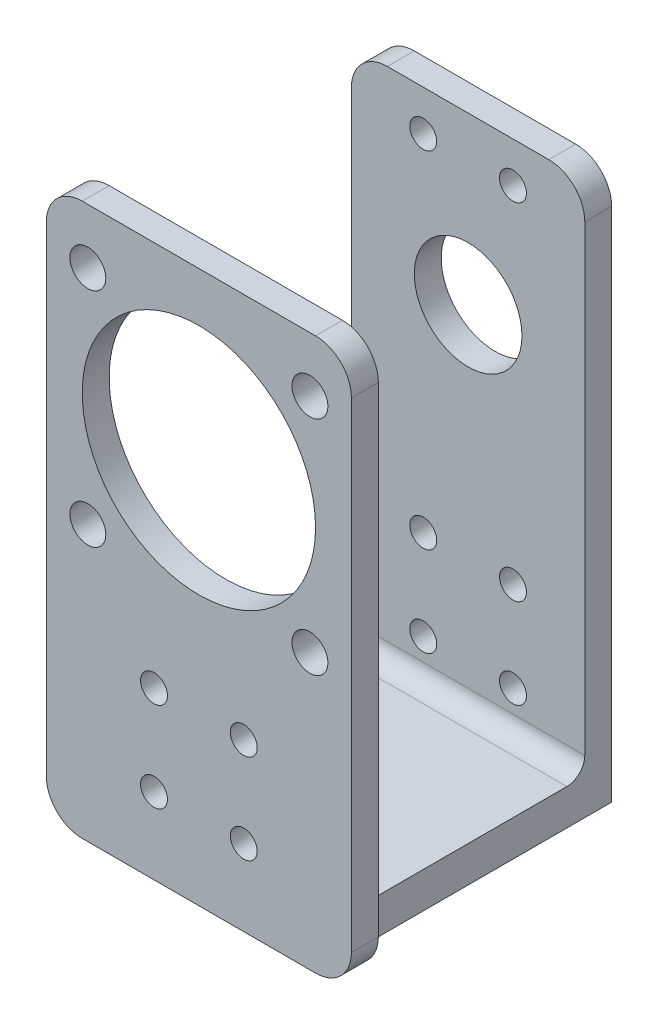
ISO-10303-21;
HEADER;
FILE_DESCRIPTION(('STEP AP214'),'2;1');
FILE_NAME('part.step','',(''),(''),'','','');
FILE_SCHEMA(('AUTOMOTIVE_DESIGN { 1 0 10303 214 1 1 1 1 }'));
ENDSEC;
DATA;
#1=APPLICATION_CONTEXT('core data for automotive mechanical design processes');
#2=APPLICATION_PROTOCOL_DEFINITION('international standard','automotive_design',2000,#1);
#3=PRODUCT_CONTEXT('',#1,'mechanical');
#4=PRODUCT('Part','Part','',(#3));
#5=PRODUCT_RELATED_PRODUCT_CATEGORY('part','',(#4));
#6=PRODUCT_DEFINITION_FORMATION('','',#4);
#7=PRODUCT_DEFINITION_CONTEXT('part definition',#1,'design');
#8=PRODUCT_DEFINITION('design','',#6,#7);
#9=PRODUCT_DEFINITION_SHAPE('','',#8);
#10=(LENGTH_UNIT() NAMED_UNIT(*) SI_UNIT(.MILLI.,.METRE.));
#11=(NAMED_UNIT(*) PLANE_ANGLE_UNIT() SI_UNIT($,.RADIAN.));
#12=(NAMED_UNIT(*) SI_UNIT($,.STERADIAN.) SOLID_ANGLE_UNIT());
#13=UNCERTAINTY_MEASURE_WITH_UNIT(LENGTH_MEASURE(1.E-05),#10,'distance_accuracy_value','');
#14=(GEOMETRIC_REPRESENTATION_CONTEXT(3) GLOBAL_UNCERTAINTY_ASSIGNED_CONTEXT((#13)) GLOBAL_UNIT_ASSIGNED_CONTEXT((#10,
#11,#12)) REPRESENTATION_CONTEXT('',''));
#15=CARTESIAN_POINT('',(0.,0.,0.));
#16=DIRECTION('',(0.,0.,1.));
#17=DIRECTION('',(1.,0.,0.));
#18=AXIS2_PLACEMENT_3D('',#15,#16,#17);
#19=CARTESIAN_POINT('',(0.,0.,3.));
#20=DIRECTION('',(0.,0.,1.));
#21=DIRECTION('',(1.,0.,0.));
#22=AXIS2_PLACEMENT_3D('',#19,#20,#21);
#23=PLANE('',#22);
#24=CARTESIAN_POINT('',(5.,-14.2448974278318,3.));
#25=DIRECTION('',(0.,0.,1.));
#26=DIRECTION('',(1.,0.,0.));
#27=AXIS2_PLACEMENT_3D('',#24,#25,#26);
#28=CIRCLE('',#27,1.5);
#29=CARTESIAN_POINT('',(6.5,-14.2448974278318,3.));
#30=VERTEX_POINT('',#29);
#31=EDGE_CURVE('E187',#30,#30,#28,.T.);
#32=ORIENTED_EDGE('',*,*,#31,.F.);
#33=EDGE_LOOP('',(#32));
#34=FACE_BOUND('',#33,.T.);
#35=CARTESIAN_POINT('',(-5.,-14.2448974278318,3.));
#36=DIRECTION('',(0.,0.,1.));
#37=DIRECTION('',(1.,0.,0.));
#38=AXIS2_PLACEMENT_3D('',#35,#36,#37);
#39=CIRCLE('',#38,1.5);
#40=CARTESIAN_POINT('',(-3.5,-14.2448974278318,3.));
#41=VERTEX_POINT('',#40);
#42=EDGE_CURVE('E362',#41,#41,#39,.T.);
#43=ORIENTED_EDGE('',*,*,#42,.F.);
#44=EDGE_LOOP('',(#43));
#45=FACE_BOUND('',#44,.T.);
#46=CARTESIAN_POINT('',(-4.99999999999999,-24.25,3.));
#47=DIRECTION('',(0.,0.,1.));
#48=DIRECTION('',(1.,0.,0.));
#49=AXIS2_PLACEMENT_3D('',#46,#47,#48);
#50=CIRCLE('',#49,1.5);
#51=CARTESIAN_POINT('',(-3.49999999999999,-24.25,3.));
#52=VERTEX_POINT('',#51);
#53=EDGE_CURVE('E257',#52,#52,#50,.T.);
#54=ORIENTED_EDGE('',*,*,#53,.F.);
#55=EDGE_LOOP('',(#54));
#56=FACE_BOUND('',#55,.T.);
#57=CARTESIAN_POINT('',(5.00000000000001,24.25,3.));
#58=DIRECTION('',(0.,0.,1.));
#59=DIRECTION('',(1.,0.,0.));
#60=AXIS2_PLACEMENT_3D('',#57,#58,#59);
#61=CIRCLE('',#60,1.5);
#62=CARTESIAN_POINT('',(6.50000000000001,24.25,3.));
#63=VERTEX_POINT('',#62);
#64=EDGE_CURVE('E269',#63,#63,#61,.T.);
#65=ORIENTED_EDGE('',*,*,#64,.F.);
#66=EDGE_LOOP('',(#65));
#67=FACE_BOUND('',#66,.T.);
#68=DIRECTION('',(-1.,0.,0.));
#69=VECTOR('',#68,1.);
#70=CARTESIAN_POINT('',(-13.,28.75,3.));
#71=LINE('',#70,#69);
#72=CARTESIAN_POINT('',(8.99999999999999,28.75,3.));
#73=VERTEX_POINT('',#72);
#74=CARTESIAN_POINT('',(-9.,28.75,3.));
#75=VERTEX_POINT('',#74);
#76=EDGE_CURVE('E282',#73,#75,#71,.T.);
#77=ORIENTED_EDGE('',*,*,#76,.T.);
#78=CARTESIAN_POINT('',(-9.,24.75,3.));
#79=DIRECTION('',(0.,0.,1.));
#80=DIRECTION('',(1.,0.,0.));
#81=AXIS2_PLACEMENT_3D('',#78,#79,#80);
#82=CIRCLE('',#81,4.);
#83=CARTESIAN_POINT('',(-13.,24.75,3.));
#84=VERTEX_POINT('',#83);
#85=EDGE_CURVE('E323',#75,#84,#82,.T.);
#86=ORIENTED_EDGE('',*,*,#85,.T.);
#87=DIRECTION('',(0.,-1.,0.));
#88=VECTOR('',#87,1.);
#89=CARTESIAN_POINT('',(-13.,28.75,3.));
#90=LINE('',#89,#88);
#91=CARTESIAN_POINT('',(-13.,-26.75,3.));
#92=VERTEX_POINT('',#91);
#93=EDGE_CURVE('E286',#84,#92,#90,.T.);
#94=ORIENTED_EDGE('',*,*,#93,.T.);
#95=DIRECTION('',(1.,0.,0.));
#96=VECTOR('',#95,1.);
#97=CARTESIAN_POINT('',(13.,-26.75,3.));
#98=LINE('',#97,#96);
#99=CARTESIAN_POINT('',(13.,-26.75,3.));
#100=VERTEX_POINT('',#99);
#101=EDGE_CURVE('E298',#92,#100,#98,.T.);
#102=ORIENTED_EDGE('',*,*,#101,.T.);
#103=DIRECTION('',(0.,1.,0.));
#104=VECTOR('',#103,1.);
#105=CARTESIAN_POINT('',(13.,28.75,3.));
#106=LINE('',#105,#104);
#107=CARTESIAN_POINT('',(13.,24.75,3.));
#108=VERTEX_POINT('',#107);
#109=EDGE_CURVE('E279',#100,#108,#106,.T.);
#110=ORIENTED_EDGE('',*,*,#109,.T.);
#111=CARTESIAN_POINT('',(9.,24.75,3.));
#112=DIRECTION('',(0.,0.,1.));
#113=DIRECTION('',(1.,0.,0.));
#114=AXIS2_PLACEMENT_3D('',#111,#112,#113);
#115=CIRCLE('',#114,4.);
#116=EDGE_CURVE('E321',#108,#73,#115,.T.);
#117=ORIENTED_EDGE('',*,*,#116,.T.);
#118=EDGE_LOOP('',(#77,#86,#94,#102,#110,#117));
#119=FACE_BOUND('',#118,.T.);
#120=CARTESIAN_POINT('',(-4.99999999999999,24.25,3.));
#121=DIRECTION('',(0.,0.,1.));
#122=DIRECTION('',(1.,0.,0.));
#123=AXIS2_PLACEMENT_3D('',#120,#121,#122);
#124=CIRCLE('',#123,1.5);
#125=CARTESIAN_POINT('',(-3.49999999999999,24.25,3.));
#126=VERTEX_POINT('',#125);
#127=EDGE_CURVE('E168',#126,#126,#124,.T.);
#128=ORIENTED_EDGE('',*,*,#127,.F.);
#129=EDGE_LOOP('',(#128));
#130=FACE_BOUND('',#129,.T.);
#131=CARTESIAN_POINT('',(5.00000000000001,-24.25,3.));
#132=DIRECTION('',(0.,0.,1.));
#133=DIRECTION('',(1.,0.,0.));
#134=AXIS2_PLACEMENT_3D('',#131,#132,#133);
#135=CIRCLE('',#134,1.5);
#136=CARTESIAN_POINT('',(6.50000000000001,-24.25,3.));
#137=VERTEX_POINT('',#136);
#138=EDGE_CURVE('E263',#137,#137,#135,.T.);
#139=ORIENTED_EDGE('',*,*,#138,.F.);
#140=EDGE_LOOP('',(#139));
#141=FACE_BOUND('',#140,.T.);
#142=CARTESIAN_POINT('',(0.,10.25,3.));
#143=DIRECTION('',(0.,0.,1.));
#144=DIRECTION('',(1.,0.,0.));
#145=AXIS2_PLACEMENT_3D('',#142,#143,#144);
#146=CIRCLE('',#145,6.);
#147=CARTESIAN_POINT('',(6.00000000000001,10.25,3.));
#148=VERTEX_POINT('',#147);
#149=EDGE_CURVE('E251',#148,#148,#146,.T.);
#150=ORIENTED_EDGE('',*,*,#149,.F.);
#151=EDGE_LOOP('',(#150));
#152=FACE_BOUND('',#151,.T.);
#153=ADVANCED_FACE('F33',(#34,#45,#56,#67,#119,#130,#141,#152),#23,.T.);
#154=CARTESIAN_POINT('',(0.,0.,0.));
#155=DIRECTION('',(0.,0.,1.));
#156=DIRECTION('',(1.,0.,0.));
#157=AXIS2_PLACEMENT_3D('',#154,#155,#156);
#158=PLANE('',#157);
#159=CARTESIAN_POINT('',(5.,-14.2448974278318,0.));
#160=DIRECTION('',(0.,0.,-1.));
#161=DIRECTION('',(-1.,0.,0.));
#162=AXIS2_PLACEMENT_3D('',#159,#160,#161);
#163=CIRCLE('',#162,1.5);
#164=CARTESIAN_POINT('',(3.5,-14.2448974278318,0.));
#165=VERTEX_POINT('',#164);
#166=EDGE_CURVE('E375',#165,#165,#163,.T.);
#167=ORIENTED_EDGE('',*,*,#166,.F.);
#168=EDGE_LOOP('',(#167));
#169=FACE_BOUND('',#168,.T.);
#170=CARTESIAN_POINT('',(-5.,-14.2448974278318,0.));
#171=DIRECTION('',(0.,0.,-1.));
#172=DIRECTION('',(-1.,0.,0.));
#173=AXIS2_PLACEMENT_3D('',#170,#171,#172);
#174=CIRCLE('',#173,1.5);
#175=CARTESIAN_POINT('',(-6.5,-14.2448974278318,0.));
#176=VERTEX_POINT('',#175);
#177=EDGE_CURVE('E384',#176,#176,#174,.T.);
#178=ORIENTED_EDGE('',*,*,#177,.F.);
#179=EDGE_LOOP('',(#178));
#180=FACE_BOUND('',#179,.T.);
#181=DIRECTION('',(0.,-1.,0.));
#182=VECTOR('',#181,1.);
#183=CARTESIAN_POINT('',(-13.,28.75,0.));
#184=LINE('',#183,#182);
#185=CARTESIAN_POINT('',(-13.,24.75,0.));
#186=VERTEX_POINT('',#185);
#187=CARTESIAN_POINT('',(-13.,-32.75,0.));
#188=VERTEX_POINT('',#187);
#189=EDGE_CURVE('E283',#186,#188,#184,.T.);
#190=ORIENTED_EDGE('',*,*,#189,.F.);
#191=CARTESIAN_POINT('',(-9.,24.75,0.));
#192=DIRECTION('',(0.,0.,1.));
#193=DIRECTION('',(1.,0.,0.));
#194=AXIS2_PLACEMENT_3D('',#191,#192,#193);
#195=CIRCLE('',#194,4.);
#196=CARTESIAN_POINT('',(-9.,28.75,0.));
#197=VERTEX_POINT('',#196);
#198=EDGE_CURVE('E314',#186,#197,#195,.F.);
#199=ORIENTED_EDGE('',*,*,#198,.T.);
#200=DIRECTION('',(-1.,0.,0.));
#201=VECTOR('',#200,1.);
#202=CARTESIAN_POINT('',(-13.,28.75,0.));
#203=LINE('',#202,#201);
#204=CARTESIAN_POINT('',(8.99999999999999,28.75,0.));
#205=VERTEX_POINT('',#204);
#206=EDGE_CURVE('E167',#205,#197,#203,.T.);
#207=ORIENTED_EDGE('',*,*,#206,.F.);
#208=CARTESIAN_POINT('',(9.,24.75,0.));
#209=DIRECTION('',(0.,0.,1.));
#210=DIRECTION('',(1.,0.,0.));
#211=AXIS2_PLACEMENT_3D('',#208,#209,#210);
#212=CIRCLE('',#211,4.);
#213=CARTESIAN_POINT('',(13.,24.75,0.));
#214=VERTEX_POINT('',#213);
#215=EDGE_CURVE('E164',#205,#214,#212,.F.);
#216=ORIENTED_EDGE('',*,*,#215,.T.);
#217=DIRECTION('',(0.,1.,0.));
#218=VECTOR('',#217,1.);
#219=CARTESIAN_POINT('',(13.,28.75,0.));
#220=LINE('',#219,#218);
#221=CARTESIAN_POINT('',(13.,-32.75,0.));
#222=VERTEX_POINT('',#221);
#223=EDGE_CURVE('E156',#222,#214,#220,.T.);
#224=ORIENTED_EDGE('',*,*,#223,.F.);
#225=DIRECTION('',(1.,0.,0.));
#226=VECTOR('',#225,1.);
#227=CARTESIAN_POINT('',(-13.,-32.75,0.));
#228=LINE('',#227,#226);
#229=EDGE_CURVE('E162',#188,#222,#228,.T.);
#230=ORIENTED_EDGE('',*,*,#229,.F.);
#231=EDGE_LOOP('',(#190,#199,#207,#216,#224,#230));
#232=FACE_BOUND('',#231,.T.);
#233=CARTESIAN_POINT('',(-4.99999999999999,24.25,0.));
#234=DIRECTION('',(0.,0.,1.));
#235=DIRECTION('',(1.,0.,0.));
#236=AXIS2_PLACEMENT_3D('',#233,#234,#235);
#237=CIRCLE('',#236,1.5);
#238=CARTESIAN_POINT('',(-3.49999999999999,24.25,0.));
#239=VERTEX_POINT('',#238);
#240=EDGE_CURVE('E272',#239,#239,#237,.T.);
#241=ORIENTED_EDGE('',*,*,#240,.T.);
#242=EDGE_LOOP('',(#241));
#243=FACE_BOUND('',#242,.T.);
#244=CARTESIAN_POINT('',(5.00000000000001,24.25,0.));
#245=DIRECTION('',(0.,0.,1.));
#246=DIRECTION('',(1.,0.,0.));
#247=AXIS2_PLACEMENT_3D('',#244,#245,#246);
#248=CIRCLE('',#247,1.5);
#249=CARTESIAN_POINT('',(6.50000000000001,24.25,0.));
#250=VERTEX_POINT('',#249);
#251=EDGE_CURVE('E266',#250,#250,#248,.T.);
#252=ORIENTED_EDGE('',*,*,#251,.T.);
#253=EDGE_LOOP('',(#252));
#254=FACE_BOUND('',#253,.T.);
#255=CARTESIAN_POINT('',(5.00000000000001,-24.25,0.));
#256=DIRECTION('',(0.,0.,1.));
#257=DIRECTION('',(1.,0.,0.));
#258=AXIS2_PLACEMENT_3D('',#255,#256,#257);
#259=CIRCLE('',#258,1.5);
#260=CARTESIAN_POINT('',(6.50000000000001,-24.25,0.));
#261=VERTEX_POINT('',#260);
#262=EDGE_CURVE('E260',#261,#261,#259,.T.);
#263=ORIENTED_EDGE('',*,*,#262,.T.);
#264=EDGE_LOOP('',(#263));
#265=FACE_BOUND('',#264,.T.);
#266=CARTESIAN_POINT('',(-4.99999999999999,-24.25,0.));
#267=DIRECTION('',(0.,0.,1.));
#268=DIRECTION('',(1.,0.,0.));
#269=AXIS2_PLACEMENT_3D('',#266,#267,#268);
#270=CIRCLE('',#269,1.5);
#271=CARTESIAN_POINT('',(-3.49999999999999,-24.25,0.));
#272=VERTEX_POINT('',#271);
#273=EDGE_CURVE('E254',#272,#272,#270,.T.);
#274=ORIENTED_EDGE('',*,*,#273,.T.);
#275=EDGE_LOOP('',(#274));
#276=FACE_BOUND('',#275,.T.);
#277=CARTESIAN_POINT('',(0.,10.25,0.));
#278=DIRECTION('',(0.,0.,1.));
#279=DIRECTION('',(1.,0.,0.));
#280=AXIS2_PLACEMENT_3D('',#277,#278,#279);
#281=CIRCLE('',#280,6.);
#282=CARTESIAN_POINT('',(6.00000000000001,10.25,0.));
#283=VERTEX_POINT('',#282);
#284=EDGE_CURVE('E248',#283,#283,#281,.T.);
#285=ORIENTED_EDGE('',*,*,#284,.T.);
#286=EDGE_LOOP('',(#285));
#287=FACE_BOUND('',#286,.T.);
#288=ADVANCED_FACE('F159',(#169,#180,#232,#243,#254,#265,#276,#287),#158,.F.);
#289=CARTESIAN_POINT('',(13.,28.75,3.));
#290=DIRECTION('',(-1.,0.,0.));
#291=DIRECTION('',(0.,-1.,0.));
#292=AXIS2_PLACEMENT_3D('',#289,#290,#291);
#293=PLANE('',#292);
#294=ORIENTED_EDGE('',*,*,#223,.T.);
#295=DIRECTION('',(0.,0.,-1.));
#296=VECTOR('',#295,1.);
#297=CARTESIAN_POINT('',(13.,24.75,3.));
#298=LINE('',#297,#296);
#299=EDGE_CURVE('E325',#214,#108,#298,.F.);
#300=ORIENTED_EDGE('',*,*,#299,.T.);
#301=ORIENTED_EDGE('',*,*,#109,.F.);
#302=CARTESIAN_POINT('',(13.,-26.75,5.));
#303=DIRECTION('',(-1.,0.,0.));
#304=DIRECTION('',(0.,-1.,0.));
#305=AXIS2_PLACEMENT_3D('',#302,#303,#304);
#306=CIRCLE('',#305,2.);
#307=CARTESIAN_POINT('',(13.,-28.75,5.));
#308=VERTEX_POINT('',#307);
#309=EDGE_CURVE('E305',#100,#308,#306,.T.);
#310=ORIENTED_EDGE('',*,*,#309,.T.);
#311=DIRECTION('',(0.,0.,-1.));
#312=VECTOR('',#311,1.);
#313=CARTESIAN_POINT('',(13.,-28.75,33.));
#314=LINE('',#313,#312);
#315=CARTESIAN_POINT('',(13.,-28.75,28.));
#316=VERTEX_POINT('',#315);
#317=EDGE_CURVE('E245',#316,#308,#314,.T.);
#318=ORIENTED_EDGE('',*,*,#317,.F.);
#319=CARTESIAN_POINT('',(13.,-26.75,28.));
#320=DIRECTION('',(-1.,0.,0.));
#321=DIRECTION('',(0.,-1.,0.));
#322=AXIS2_PLACEMENT_3D('',#319,#320,#321);
#323=CIRCLE('',#322,2.);
#324=CARTESIAN_POINT('',(13.,-26.75,30.));
#325=VERTEX_POINT('',#324);
#326=EDGE_CURVE('E303',#316,#325,#323,.T.);
#327=ORIENTED_EDGE('',*,*,#326,.T.);
#328=DIRECTION('',(0.,-1.,0.));
#329=VECTOR('',#328,1.);
#330=CARTESIAN_POINT('',(13.,28.75,30.));
#331=LINE('',#330,#329);
#332=CARTESIAN_POINT('',(13.,-32.75,30.));
#333=VERTEX_POINT('',#332);
#334=EDGE_CURVE('E175',#325,#333,#331,.T.);
#335=ORIENTED_EDGE('',*,*,#334,.T.);
#336=DIRECTION('',(0.,0.,1.));
#337=VECTOR('',#336,1.);
#338=CARTESIAN_POINT('',(13.,-32.75,0.));
#339=LINE('',#338,#337);
#340=EDGE_CURVE('E172',#222,#333,#339,.T.);
#341=ORIENTED_EDGE('',*,*,#340,.F.);
#342=EDGE_LOOP('',(#294,#300,#301,#310,#318,#327,#335,#341));
#343=FACE_BOUND('',#342,.T.);
#344=ADVANCED_FACE('F173',(#343),#293,.F.);
#345=CARTESIAN_POINT('',(-13.,28.75,3.));
#346=DIRECTION('',(0.,-1.,0.));
#347=DIRECTION('',(0.,0.,-1.));
#348=AXIS2_PLACEMENT_3D('',#345,#346,#347);
#349=PLANE('',#348);
#350=ORIENTED_EDGE('',*,*,#206,.T.);
#351=DIRECTION('',(0.,0.,-1.));
#352=VECTOR('',#351,1.);
#353=CARTESIAN_POINT('',(-9.,28.75,3.));
#354=LINE('',#353,#352);
#355=EDGE_CURVE('E319',#197,#75,#354,.F.);
#356=ORIENTED_EDGE('',*,*,#355,.T.);
#357=ORIENTED_EDGE('',*,*,#76,.F.);
#358=DIRECTION('',(0.,0.,-1.));
#359=VECTOR('',#358,1.);
#360=CARTESIAN_POINT('',(9.,28.75,3.));
#361=LINE('',#360,#359);
#362=EDGE_CURVE('E316',#73,#205,#361,.T.);
#363=ORIENTED_EDGE('',*,*,#362,.T.);
#364=EDGE_LOOP('',(#350,#356,#357,#363));
#365=FACE_BOUND('',#364,.T.);
#366=ADVANCED_FACE('F428',(#365),#349,.F.);
#367=CARTESIAN_POINT('',(-13.,28.75,3.));
#368=DIRECTION('',(1.,0.,0.));
#369=DIRECTION('',(0.,1.,0.));
#370=AXIS2_PLACEMENT_3D('',#367,#368,#369);
#371=PLANE('',#370);
#372=ORIENTED_EDGE('',*,*,#93,.F.);
#373=DIRECTION('',(0.,0.,-1.));
#374=VECTOR('',#373,1.);
#375=CARTESIAN_POINT('',(-13.,24.75,3.));
#376=LINE('',#375,#374);
#377=EDGE_CURVE('E310',#84,#186,#376,.T.);
#378=ORIENTED_EDGE('',*,*,#377,.T.);
#379=ORIENTED_EDGE('',*,*,#189,.T.);
#380=DIRECTION('',(0.,0.,-1.));
#381=VECTOR('',#380,1.);
#382=CARTESIAN_POINT('',(-13.,-32.75,30.));
#383=LINE('',#382,#381);
#384=CARTESIAN_POINT('',(-13.,-32.75,30.));
#385=VERTEX_POINT('',#384);
#386=EDGE_CURVE('E184',#385,#188,#383,.T.);
#387=ORIENTED_EDGE('',*,*,#386,.F.);
#388=DIRECTION('',(0.,1.,0.));
#389=VECTOR('',#388,1.);
#390=CARTESIAN_POINT('',(-13.,28.75,30.));
#391=LINE('',#390,#389);
#392=CARTESIAN_POINT('',(-13.,-26.75,30.));
#393=VERTEX_POINT('',#392);
#394=EDGE_CURVE('E234',#385,#393,#391,.T.);
#395=ORIENTED_EDGE('',*,*,#394,.T.);
#396=CARTESIAN_POINT('',(-13.,-26.75,28.));
#397=DIRECTION('',(1.,0.,0.));
#398=DIRECTION('',(0.,1.,0.));
#399=AXIS2_PLACEMENT_3D('',#396,#397,#398);
#400=CIRCLE('',#399,2.);
#401=CARTESIAN_POINT('',(-13.,-28.75,28.));
#402=VERTEX_POINT('',#401);
#403=EDGE_CURVE('E301',#393,#402,#400,.T.);
#404=ORIENTED_EDGE('',*,*,#403,.T.);
#405=DIRECTION('',(0.,0.,-1.));
#406=VECTOR('',#405,1.);
#407=CARTESIAN_POINT('',(-13.,-28.75,33.));
#408=LINE('',#407,#406);
#409=CARTESIAN_POINT('',(-13.,-28.75,5.));
#410=VERTEX_POINT('',#409);
#411=EDGE_CURVE('E244',#402,#410,#408,.T.);
#412=ORIENTED_EDGE('',*,*,#411,.T.);
#413=CARTESIAN_POINT('',(-13.,-26.75,5.));
#414=DIRECTION('',(1.,0.,0.));
#415=DIRECTION('',(0.,1.,0.));
#416=AXIS2_PLACEMENT_3D('',#413,#414,#415);
#417=CIRCLE('',#416,2.);
#418=EDGE_CURVE('E307',#410,#92,#417,.T.);
#419=ORIENTED_EDGE('',*,*,#418,.T.);
#420=EDGE_LOOP('',(#372,#378,#379,#387,#395,#404,#412,#419));
#421=FACE_BOUND('',#420,.T.);
#422=ADVANCED_FACE('F425',(#421),#371,.F.);
#423=CARTESIAN_POINT('',(-4.99999999999999,24.25,3.));
#424=DIRECTION('',(0.,0.,-1.));
#425=DIRECTION('',(-1.,0.,0.));
#426=AXIS2_PLACEMENT_3D('',#423,#424,#425);
#427=CYLINDRICAL_SURFACE('',#426,1.5);
#428=ORIENTED_EDGE('',*,*,#127,.T.);
#429=EDGE_LOOP('',(#428));
#430=FACE_BOUND('',#429,.T.);
#431=ORIENTED_EDGE('',*,*,#240,.F.);
#432=EDGE_LOOP('',(#431));
#433=FACE_BOUND('',#432,.T.);
#434=ADVANCED_FACE('F422',(#430,#433),#427,.F.);
#435=CARTESIAN_POINT('',(5.00000000000001,24.25,3.));
#436=DIRECTION('',(0.,0.,-1.));
#437=DIRECTION('',(-1.,0.,0.));
#438=AXIS2_PLACEMENT_3D('',#435,#436,#437);
#439=CYLINDRICAL_SURFACE('',#438,1.5);
#440=ORIENTED_EDGE('',*,*,#64,.T.);
#441=EDGE_LOOP('',(#440));
#442=FACE_BOUND('',#441,.T.);
#443=ORIENTED_EDGE('',*,*,#251,.F.);
#444=EDGE_LOOP('',(#443));
#445=FACE_BOUND('',#444,.T.);
#446=ADVANCED_FACE('F528',(#442,#445),#439,.F.);
#447=CARTESIAN_POINT('',(5.00000000000001,-24.25,3.));
#448=DIRECTION('',(0.,0.,-1.));
#449=DIRECTION('',(-1.,0.,0.));
#450=AXIS2_PLACEMENT_3D('',#447,#448,#449);
#451=CYLINDRICAL_SURFACE('',#450,1.5);
#452=ORIENTED_EDGE('',*,*,#138,.T.);
#453=EDGE_LOOP('',(#452));
#454=FACE_BOUND('',#453,.T.);
#455=ORIENTED_EDGE('',*,*,#262,.F.);
#456=EDGE_LOOP('',(#455));
#457=FACE_BOUND('',#456,.T.);
#458=ADVANCED_FACE('F525',(#454,#457),#451,.F.);
#459=CARTESIAN_POINT('',(-4.99999999999999,-24.25,3.));
#460=DIRECTION('',(0.,0.,-1.));
#461=DIRECTION('',(-1.,0.,0.));
#462=AXIS2_PLACEMENT_3D('',#459,#460,#461);
#463=CYLINDRICAL_SURFACE('',#462,1.5);
#464=ORIENTED_EDGE('',*,*,#53,.T.);
#465=EDGE_LOOP('',(#464));
#466=FACE_BOUND('',#465,.T.);
#467=ORIENTED_EDGE('',*,*,#273,.F.);
#468=EDGE_LOOP('',(#467));
#469=FACE_BOUND('',#468,.T.);
#470=ADVANCED_FACE('F518',(#466,#469),#463,.F.);
#471=CARTESIAN_POINT('',(0.,10.25,3.));
#472=DIRECTION('',(0.,0.,-1.));
#473=DIRECTION('',(-1.,0.,0.));
#474=AXIS2_PLACEMENT_3D('',#471,#472,#473);
#475=CYLINDRICAL_SURFACE('',#474,6.);
#476=ORIENTED_EDGE('',*,*,#149,.T.);
#477=EDGE_LOOP('',(#476));
#478=FACE_BOUND('',#477,.T.);
#479=ORIENTED_EDGE('',*,*,#284,.F.);
#480=EDGE_LOOP('',(#479));
#481=FACE_BOUND('',#480,.T.);
#482=ADVANCED_FACE('F510',(#478,#481),#475,.F.);
#483=CARTESIAN_POINT('',(-13.,-28.75,33.));
#484=DIRECTION('',(0.,1.,0.));
#485=DIRECTION('',(0.,0.,1.));
#486=AXIS2_PLACEMENT_3D('',#483,#484,#485);
#487=PLANE('',#486);
#488=ORIENTED_EDGE('',*,*,#411,.F.);
#489=DIRECTION('',(-1.,0.,0.));
#490=VECTOR('',#489,1.);
#491=CARTESIAN_POINT('',(13.,-28.75,28.));
#492=LINE('',#491,#490);
#493=EDGE_CURVE('E296',#402,#316,#492,.F.);
#494=ORIENTED_EDGE('',*,*,#493,.T.);
#495=ORIENTED_EDGE('',*,*,#317,.T.);
#496=DIRECTION('',(1.,0.,0.));
#497=VECTOR('',#496,1.);
#498=CARTESIAN_POINT('',(-13.,-28.75,5.));
#499=LINE('',#498,#497);
#500=EDGE_CURVE('E294',#308,#410,#499,.F.);
#501=ORIENTED_EDGE('',*,*,#500,.T.);
#502=EDGE_LOOP('',(#488,#494,#495,#501));
#503=FACE_BOUND('',#502,.T.);
#504=ADVANCED_FACE('F507',(#503),#487,.T.);
#505=CARTESIAN_POINT('',(0.,0.,33.));
#506=DIRECTION('',(0.,0.,1.));
#507=DIRECTION('',(1.,0.,0.));
#508=AXIS2_PLACEMENT_3D('',#505,#506,#507);
#509=PLANE('',#508);
#510=CARTESIAN_POINT('',(-4.99999999999999,-24.25,33.));
#511=DIRECTION('',(0.,0.,-1.));
#512=DIRECTION('',(-1.,0.,0.));
#513=AXIS2_PLACEMENT_3D('',#510,#511,#512);
#514=CIRCLE('',#513,1.5);
#515=CARTESIAN_POINT('',(-6.49999999999999,-24.25,33.));
#516=VERTEX_POINT('',#515);
#517=EDGE_CURVE('E374',#516,#516,#514,.T.);
#518=ORIENTED_EDGE('',*,*,#517,.T.);
#519=EDGE_LOOP('',(#518));
#520=FACE_BOUND('',#519,.T.);
#521=CARTESIAN_POINT('',(5.,-14.2448974278318,33.));
#522=DIRECTION('',(0.,0.,-1.));
#523=DIRECTION('',(-1.,0.,0.));
#524=AXIS2_PLACEMENT_3D('',#521,#522,#523);
#525=CIRCLE('',#524,1.5);
#526=CARTESIAN_POINT('',(3.5,-14.2448974278318,33.));
#527=VERTEX_POINT('',#526);
#528=EDGE_CURVE('E378',#527,#527,#525,.T.);
#529=ORIENTED_EDGE('',*,*,#528,.T.);
#530=EDGE_LOOP('',(#529));
#531=FACE_BOUND('',#530,.T.);
#532=CARTESIAN_POINT('',(-5.,-14.2448974278318,33.));
#533=DIRECTION('',(0.,0.,-1.));
#534=DIRECTION('',(-1.,0.,0.));
#535=AXIS2_PLACEMENT_3D('',#532,#533,#534);
#536=CIRCLE('',#535,1.5);
#537=CARTESIAN_POINT('',(-6.5,-14.2448974278318,33.));
#538=VERTEX_POINT('',#537);
#539=EDGE_CURVE('E379',#538,#538,#536,.T.);
#540=ORIENTED_EDGE('',*,*,#539,.T.);
#541=EDGE_LOOP('',(#540));
#542=FACE_BOUND('',#541,.T.);
#543=CARTESIAN_POINT('',(5.00000000000001,-24.25,33.));
#544=DIRECTION('',(0.,0.,-1.));
#545=DIRECTION('',(-1.,0.,0.));
#546=AXIS2_PLACEMENT_3D('',#543,#544,#545);
#547=CIRCLE('',#546,1.5);
#548=CARTESIAN_POINT('',(3.50000000000001,-24.25,33.));
#549=VERTEX_POINT('',#548);
#550=EDGE_CURVE('E360',#549,#549,#547,.T.);
#551=ORIENTED_EDGE('',*,*,#550,.T.);
#552=EDGE_LOOP('',(#551));
#553=FACE_BOUND('',#552,.T.);
#554=DIRECTION('',(-1.,0.,0.));
#555=VECTOR('',#554,1.);
#556=CARTESIAN_POINT('',(-17.,28.75,33.));
#557=LINE('',#556,#555);
#558=CARTESIAN_POINT('',(13.,28.75,33.));
#559=VERTEX_POINT('',#558);
#560=CARTESIAN_POINT('',(-13.,28.75,33.));
#561=VERTEX_POINT('',#560);
#562=EDGE_CURVE('E229',#559,#561,#557,.T.);
#563=ORIENTED_EDGE('',*,*,#562,.T.);
#564=CARTESIAN_POINT('',(-13.,24.75,33.));
#565=DIRECTION('',(0.,0.,1.));
#566=DIRECTION('',(1.,0.,0.));
#567=AXIS2_PLACEMENT_3D('',#564,#565,#566);
#568=CIRCLE('',#567,4.);
#569=CARTESIAN_POINT('',(-17.,24.75,33.));
#570=VERTEX_POINT('',#569);
#571=EDGE_CURVE('E338',#561,#570,#568,.T.);
#572=ORIENTED_EDGE('',*,*,#571,.T.);
#573=DIRECTION('',(0.,-1.,0.));
#574=VECTOR('',#573,1.);
#575=CARTESIAN_POINT('',(-17.,-31.75,33.));
#576=LINE('',#575,#574);
#577=CARTESIAN_POINT('',(-17.,-28.75,33.));
#578=VERTEX_POINT('',#577);
#579=EDGE_CURVE('E222',#570,#578,#576,.T.);
#580=ORIENTED_EDGE('',*,*,#579,.T.);
#581=CARTESIAN_POINT('',(-13.,-28.75,33.));
#582=DIRECTION('',(0.,0.,1.));
#583=DIRECTION('',(1.,0.,0.));
#584=AXIS2_PLACEMENT_3D('',#581,#582,#583);
#585=CIRCLE('',#584,4.);
#586=CARTESIAN_POINT('',(-13.,-32.75,33.));
#587=VERTEX_POINT('',#586);
#588=EDGE_CURVE('E332',#578,#587,#585,.T.);
#589=ORIENTED_EDGE('',*,*,#588,.T.);
#590=DIRECTION('',(-1.,0.,0.));
#591=VECTOR('',#590,1.);
#592=CARTESIAN_POINT('',(17.,-32.75,33.));
#593=LINE('',#592,#591);
#594=CARTESIAN_POINT('',(13.,-32.75,33.));
#595=VERTEX_POINT('',#594);
#596=EDGE_CURVE('E178',#595,#587,#593,.T.);
#597=ORIENTED_EDGE('',*,*,#596,.F.);
#598=CARTESIAN_POINT('',(13.,-28.75,33.));
#599=DIRECTION('',(0.,0.,1.));
#600=DIRECTION('',(1.,0.,0.));
#601=AXIS2_PLACEMENT_3D('',#598,#599,#600);
#602=CIRCLE('',#601,4.);
#603=CARTESIAN_POINT('',(17.,-28.75,33.));
#604=VERTEX_POINT('',#603);
#605=EDGE_CURVE('E334',#595,#604,#602,.T.);
#606=ORIENTED_EDGE('',*,*,#605,.T.);
#607=DIRECTION('',(0.,1.,0.));
#608=VECTOR('',#607,1.);
#609=CARTESIAN_POINT('',(17.,-31.75,33.));
#610=LINE('',#609,#608);
#611=CARTESIAN_POINT('',(17.,24.75,33.));
#612=VERTEX_POINT('',#611);
#613=EDGE_CURVE('E237',#604,#612,#610,.T.);
#614=ORIENTED_EDGE('',*,*,#613,.T.);
#615=CARTESIAN_POINT('',(13.,24.75,33.));
#616=DIRECTION('',(0.,0.,1.));
#617=DIRECTION('',(1.,0.,0.));
#618=AXIS2_PLACEMENT_3D('',#615,#616,#617);
#619=CIRCLE('',#618,4.);
#620=EDGE_CURVE('E336',#612,#559,#619,.T.);
#621=ORIENTED_EDGE('',*,*,#620,.T.);
#622=EDGE_LOOP('',(#563,#572,#580,#589,#597,#606,#614,#621));
#623=FACE_BOUND('',#622,.T.);
#624=CARTESIAN_POINT('',(-12.3743686707647,22.6243686707638,33.));
#625=DIRECTION('',(0.,0.,1.));
#626=DIRECTION('',(1.,0.,0.));
#627=AXIS2_PLACEMENT_3D('',#624,#625,#626);
#628=CIRCLE('',#627,2.);
#629=CARTESIAN_POINT('',(-10.3743686707647,22.6243686707638,33.));
#630=VERTEX_POINT('',#629);
#631=EDGE_CURVE('E194',#630,#630,#628,.T.);
#632=ORIENTED_EDGE('',*,*,#631,.F.);
#633=EDGE_LOOP('',(#632));
#634=FACE_BOUND('',#633,.T.);
#635=CARTESIAN_POINT('',(-12.3743686707637,-2.1243686707654,33.));
#636=DIRECTION('',(0.,0.,1.));
#637=DIRECTION('',(1.,0.,0.));
#638=AXIS2_PLACEMENT_3D('',#635,#636,#637);
#639=CIRCLE('',#638,2.);
#640=CARTESIAN_POINT('',(-10.3743686707637,-2.1243686707654,33.));
#641=VERTEX_POINT('',#640);
#642=EDGE_CURVE('E198',#641,#641,#639,.T.);
#643=ORIENTED_EDGE('',*,*,#642,.F.);
#644=EDGE_LOOP('',(#643));
#645=FACE_BOUND('',#644,.T.);
#646=CARTESIAN_POINT('',(12.3743686707655,-2.12436867076437,33.));
#647=DIRECTION('',(0.,0.,1.));
#648=DIRECTION('',(1.,0.,0.));
#649=AXIS2_PLACEMENT_3D('',#646,#647,#648);
#650=CIRCLE('',#649,2.);
#651=CARTESIAN_POINT('',(14.3743686707655,-2.12436867076437,33.));
#652=VERTEX_POINT('',#651);
#653=EDGE_CURVE('E204',#652,#652,#650,.T.);
#654=ORIENTED_EDGE('',*,*,#653,.F.);
#655=EDGE_LOOP('',(#654));
#656=FACE_BOUND('',#655,.T.);
#657=CARTESIAN_POINT('',(0.,10.25,33.));
#658=DIRECTION('',(0.,0.,1.));
#659=DIRECTION('',(1.,0.,0.));
#660=AXIS2_PLACEMENT_3D('',#657,#658,#659);
#661=CIRCLE('',#660,13.);
#662=CARTESIAN_POINT('',(13.,10.25,33.));
#663=VERTEX_POINT('',#662);
#664=EDGE_CURVE('E210',#663,#663,#661,.T.);
#665=ORIENTED_EDGE('',*,*,#664,.F.);
#666=EDGE_LOOP('',(#665));
#667=FACE_BOUND('',#666,.T.);
#668=CARTESIAN_POINT('',(12.3743686707644,22.6243686707648,33.));
#669=DIRECTION('',(0.,0.,1.));
#670=DIRECTION('',(1.,0.,0.));
#671=AXIS2_PLACEMENT_3D('',#668,#669,#670);
#672=CIRCLE('',#671,2.);
#673=CARTESIAN_POINT('',(14.3743686707644,22.6243686707648,33.));
#674=VERTEX_POINT('',#673);
#675=EDGE_CURVE('E216',#674,#674,#672,.T.);
#676=ORIENTED_EDGE('',*,*,#675,.F.);
#677=EDGE_LOOP('',(#676));
#678=FACE_BOUND('',#677,.T.);
#679=ADVANCED_FACE('F390',(#520,#531,#542,#553,#623,#634,#645,#656,#667,#678),#509,.T.);
#680=CARTESIAN_POINT('',(0.,0.,30.));
#681=DIRECTION('',(0.,0.,-1.));
#682=DIRECTION('',(-1.,0.,0.));
#683=AXIS2_PLACEMENT_3D('',#680,#681,#682);
#684=PLANE('',#683);
#685=CARTESIAN_POINT('',(-4.99999999999999,-24.25,30.));
#686=DIRECTION('',(0.,0.,-1.));
#687=DIRECTION('',(-1.,0.,0.));
#688=AXIS2_PLACEMENT_3D('',#685,#686,#687);
#689=CIRCLE('',#688,1.5);
#690=CARTESIAN_POINT('',(-6.49999999999999,-24.25,30.));
#691=VERTEX_POINT('',#690);
#692=EDGE_CURVE('E37',#691,#691,#689,.T.);
#693=ORIENTED_EDGE('',*,*,#692,.F.);
#694=EDGE_LOOP('',(#693));
#695=FACE_BOUND('',#694,.T.);
#696=CARTESIAN_POINT('',(5.,-14.2448974278318,30.));
#697=DIRECTION('',(0.,0.,-1.));
#698=DIRECTION('',(-1.,0.,0.));
#699=AXIS2_PLACEMENT_3D('',#696,#697,#698);
#700=CIRCLE('',#699,1.5);
#701=CARTESIAN_POINT('',(3.5,-14.2448974278318,30.));
#702=VERTEX_POINT('',#701);
#703=EDGE_CURVE('E363',#702,#702,#700,.T.);
#704=ORIENTED_EDGE('',*,*,#703,.F.);
#705=EDGE_LOOP('',(#704));
#706=FACE_BOUND('',#705,.T.);
#707=CARTESIAN_POINT('',(-5.,-14.2448974278318,30.));
#708=DIRECTION('',(0.,0.,-1.));
#709=DIRECTION('',(-1.,0.,0.));
#710=AXIS2_PLACEMENT_3D('',#707,#708,#709);
#711=CIRCLE('',#710,1.5);
#712=CARTESIAN_POINT('',(-6.5,-14.2448974278318,30.));
#713=VERTEX_POINT('',#712);
#714=EDGE_CURVE('E359',#713,#713,#711,.T.);
#715=ORIENTED_EDGE('',*,*,#714,.F.);
#716=EDGE_LOOP('',(#715));
#717=FACE_BOUND('',#716,.T.);
#718=CARTESIAN_POINT('',(5.00000000000001,-24.25,30.));
#719=DIRECTION('',(0.,0.,-1.));
#720=DIRECTION('',(-1.,0.,0.));
#721=AXIS2_PLACEMENT_3D('',#718,#719,#720);
#722=CIRCLE('',#721,1.5);
#723=CARTESIAN_POINT('',(3.50000000000001,-24.25,30.));
#724=VERTEX_POINT('',#723);
#725=EDGE_CURVE('E356',#724,#724,#722,.T.);
#726=ORIENTED_EDGE('',*,*,#725,.F.);
#727=EDGE_LOOP('',(#726));
#728=FACE_BOUND('',#727,.T.);
#729=CARTESIAN_POINT('',(12.3743686707644,22.6243686707648,30.));
#730=DIRECTION('',(0.,0.,1.));
#731=DIRECTION('',(1.,0.,0.));
#732=AXIS2_PLACEMENT_3D('',#729,#730,#731);
#733=CIRCLE('',#732,2.);
#734=CARTESIAN_POINT('',(14.3743686707644,22.6243686707648,30.));
#735=VERTEX_POINT('',#734);
#736=EDGE_CURVE('E219',#735,#735,#733,.T.);
#737=ORIENTED_EDGE('',*,*,#736,.T.);
#738=EDGE_LOOP('',(#737));
#739=FACE_BOUND('',#738,.T.);
#740=CARTESIAN_POINT('',(0.,10.25,30.));
#741=DIRECTION('',(0.,0.,1.));
#742=DIRECTION('',(1.,0.,0.));
#743=AXIS2_PLACEMENT_3D('',#740,#741,#742);
#744=CIRCLE('',#743,13.);
#745=CARTESIAN_POINT('',(13.,10.25,30.));
#746=VERTEX_POINT('',#745);
#747=EDGE_CURVE('E213',#746,#746,#744,.T.);
#748=ORIENTED_EDGE('',*,*,#747,.T.);
#749=EDGE_LOOP('',(#748));
#750=FACE_BOUND('',#749,.T.);
#751=CARTESIAN_POINT('',(12.3743686707655,-2.12436867076437,30.));
#752=DIRECTION('',(0.,0.,1.));
#753=DIRECTION('',(1.,0.,0.));
#754=AXIS2_PLACEMENT_3D('',#751,#752,#753);
#755=CIRCLE('',#754,2.);
#756=CARTESIAN_POINT('',(14.3743686707655,-2.12436867076437,30.));
#757=VERTEX_POINT('',#756);
#758=EDGE_CURVE('E207',#757,#757,#755,.T.);
#759=ORIENTED_EDGE('',*,*,#758,.T.);
#760=EDGE_LOOP('',(#759));
#761=FACE_BOUND('',#760,.T.);
#762=CARTESIAN_POINT('',(-12.3743686707637,-2.1243686707654,30.));
#763=DIRECTION('',(0.,0.,1.));
#764=DIRECTION('',(1.,0.,0.));
#765=AXIS2_PLACEMENT_3D('',#762,#763,#764);
#766=CIRCLE('',#765,2.);
#767=CARTESIAN_POINT('',(-10.3743686707637,-2.1243686707654,30.));
#768=VERTEX_POINT('',#767);
#769=EDGE_CURVE('E201',#768,#768,#766,.T.);
#770=ORIENTED_EDGE('',*,*,#769,.T.);
#771=EDGE_LOOP('',(#770));
#772=FACE_BOUND('',#771,.T.);
#773=CARTESIAN_POINT('',(-12.3743686707647,22.6243686707638,30.));
#774=DIRECTION('',(0.,0.,1.));
#775=DIRECTION('',(1.,0.,0.));
#776=AXIS2_PLACEMENT_3D('',#773,#774,#775);
#777=CIRCLE('',#776,2.);
#778=CARTESIAN_POINT('',(-10.3743686707647,22.6243686707638,30.));
#779=VERTEX_POINT('',#778);
#780=EDGE_CURVE('E195',#779,#779,#777,.T.);
#781=ORIENTED_EDGE('',*,*,#780,.T.);
#782=EDGE_LOOP('',(#781));
#783=FACE_BOUND('',#782,.T.);
#784=DIRECTION('',(0.,-1.,0.));
#785=VECTOR('',#784,1.);
#786=CARTESIAN_POINT('',(-17.,-31.75,30.));
#787=LINE('',#786,#785);
#788=CARTESIAN_POINT('',(-17.,24.75,30.));
#789=VERTEX_POINT('',#788);
#790=CARTESIAN_POINT('',(-17.,-28.75,30.));
#791=VERTEX_POINT('',#790);
#792=EDGE_CURVE('E225',#789,#791,#787,.T.);
#793=ORIENTED_EDGE('',*,*,#792,.F.);
#794=CARTESIAN_POINT('',(-13.,24.75,30.));
#795=DIRECTION('',(0.,0.,-1.));
#796=DIRECTION('',(-1.,0.,0.));
#797=AXIS2_PLACEMENT_3D('',#794,#795,#796);
#798=CIRCLE('',#797,4.);
#799=CARTESIAN_POINT('',(-13.,28.75,30.));
#800=VERTEX_POINT('',#799);
#801=EDGE_CURVE('E349',#789,#800,#798,.T.);
#802=ORIENTED_EDGE('',*,*,#801,.T.);
#803=DIRECTION('',(-1.,0.,0.));
#804=VECTOR('',#803,1.);
#805=CARTESIAN_POINT('',(-17.,28.75,30.));
#806=LINE('',#805,#804);
#807=CARTESIAN_POINT('',(13.,28.75,30.));
#808=VERTEX_POINT('',#807);
#809=EDGE_CURVE('E231',#808,#800,#806,.T.);
#810=ORIENTED_EDGE('',*,*,#809,.F.);
#811=CARTESIAN_POINT('',(13.,24.75,30.));
#812=DIRECTION('',(0.,0.,-1.));
#813=DIRECTION('',(-1.,0.,0.));
#814=AXIS2_PLACEMENT_3D('',#811,#812,#813);
#815=CIRCLE('',#814,4.);
#816=CARTESIAN_POINT('',(17.,24.75,30.));
#817=VERTEX_POINT('',#816);
#818=EDGE_CURVE('E50',#808,#817,#815,.T.);
#819=ORIENTED_EDGE('',*,*,#818,.T.);
#820=DIRECTION('',(0.,1.,0.));
#821=VECTOR('',#820,1.);
#822=CARTESIAN_POINT('',(17.,-31.75,30.));
#823=LINE('',#822,#821);
#824=CARTESIAN_POINT('',(17.,-28.75,30.));
#825=VERTEX_POINT('',#824);
#826=EDGE_CURVE('E228',#825,#817,#823,.T.);
#827=ORIENTED_EDGE('',*,*,#826,.F.);
#828=CARTESIAN_POINT('',(13.,-28.75,30.));
#829=DIRECTION('',(0.,0.,-1.));
#830=DIRECTION('',(-1.,0.,0.));
#831=AXIS2_PLACEMENT_3D('',#828,#829,#830);
#832=CIRCLE('',#831,4.);
#833=EDGE_CURVE('E346',#825,#333,#832,.T.);
#834=ORIENTED_EDGE('',*,*,#833,.T.);
#835=ORIENTED_EDGE('',*,*,#334,.F.);
#836=DIRECTION('',(-1.,0.,0.));
#837=VECTOR('',#836,1.);
#838=CARTESIAN_POINT('',(-13.,-26.75,30.));
#839=LINE('',#838,#837);
#840=EDGE_CURVE('E287',#325,#393,#839,.T.);
#841=ORIENTED_EDGE('',*,*,#840,.T.);
#842=ORIENTED_EDGE('',*,*,#394,.F.);
#843=CARTESIAN_POINT('',(-13.,-28.75,30.));
#844=DIRECTION('',(0.,0.,-1.));
#845=DIRECTION('',(-1.,0.,0.));
#846=AXIS2_PLACEMENT_3D('',#843,#844,#845);
#847=CIRCLE('',#846,4.);
#848=EDGE_CURVE('E344',#385,#791,#847,.T.);
#849=ORIENTED_EDGE('',*,*,#848,.T.);
#850=EDGE_LOOP('',(#793,#802,#810,#819,#827,#834,#835,#841,#842,#849));
#851=FACE_BOUND('',#850,.T.);
#852=ADVANCED_FACE('F468',(#695,#706,#717,#728,#739,#750,#761,#772,#783,#851),#684,.T.);
#853=CARTESIAN_POINT('',(-17.,-31.75,30.));
#854=DIRECTION('',(-1.,0.,0.));
#855=DIRECTION('',(0.,0.,1.));
#856=AXIS2_PLACEMENT_3D('',#853,#854,#855);
#857=PLANE('',#856);
#858=ORIENTED_EDGE('',*,*,#579,.F.);
#859=DIRECTION('',(0.,0.,1.));
#860=VECTOR('',#859,1.);
#861=CARTESIAN_POINT('',(-17.,24.75,30.));
#862=LINE('',#861,#860);
#863=EDGE_CURVE('E342',#570,#789,#862,.F.);
#864=ORIENTED_EDGE('',*,*,#863,.T.);
#865=ORIENTED_EDGE('',*,*,#792,.T.);
#866=DIRECTION('',(0.,0.,-1.));
#867=VECTOR('',#866,1.);
#868=CARTESIAN_POINT('',(-17.,-28.75,30.));
#869=LINE('',#868,#867);
#870=EDGE_CURVE('E340',#791,#578,#869,.F.);
#871=ORIENTED_EDGE('',*,*,#870,.T.);
#872=EDGE_LOOP('',(#858,#864,#865,#871));
#873=FACE_BOUND('',#872,.T.);
#874=ADVANCED_FACE('F483',(#873),#857,.T.);
#875=CARTESIAN_POINT('',(-17.,28.75,30.));
#876=DIRECTION('',(0.,1.,0.));
#877=DIRECTION('',(0.,0.,1.));
#878=AXIS2_PLACEMENT_3D('',#875,#876,#877);
#879=PLANE('',#878);
#880=ORIENTED_EDGE('',*,*,#809,.T.);
#881=DIRECTION('',(0.,0.,1.));
#882=VECTOR('',#881,1.);
#883=CARTESIAN_POINT('',(-13.,28.75,30.));
#884=LINE('',#883,#882);
#885=EDGE_CURVE('E329',#800,#561,#884,.T.);
#886=ORIENTED_EDGE('',*,*,#885,.T.);
#887=ORIENTED_EDGE('',*,*,#562,.F.);
#888=DIRECTION('',(0.,0.,1.));
#889=VECTOR('',#888,1.);
#890=CARTESIAN_POINT('',(13.,28.75,30.));
#891=LINE('',#890,#889);
#892=EDGE_CURVE('E327',#559,#808,#891,.F.);
#893=ORIENTED_EDGE('',*,*,#892,.T.);
#894=EDGE_LOOP('',(#880,#886,#887,#893));
#895=FACE_BOUND('',#894,.T.);
#896=ADVANCED_FACE('F476',(#895),#879,.T.);
#897=CARTESIAN_POINT('',(17.,-31.75,30.));
#898=DIRECTION('',(1.,0.,0.));
#899=DIRECTION('',(0.,0.,-1.));
#900=AXIS2_PLACEMENT_3D('',#897,#898,#899);
#901=PLANE('',#900);
#902=ORIENTED_EDGE('',*,*,#826,.T.);
#903=DIRECTION('',(0.,0.,1.));
#904=VECTOR('',#903,1.);
#905=CARTESIAN_POINT('',(17.,24.75,30.));
#906=LINE('',#905,#904);
#907=EDGE_CURVE('E352',#817,#612,#906,.T.);
#908=ORIENTED_EDGE('',*,*,#907,.T.);
#909=ORIENTED_EDGE('',*,*,#613,.F.);
#910=DIRECTION('',(0.,0.,1.));
#911=VECTOR('',#910,1.);
#912=CARTESIAN_POINT('',(17.,-28.75,30.));
#913=LINE('',#912,#911);
#914=EDGE_CURVE('E57',#604,#825,#913,.F.);
#915=ORIENTED_EDGE('',*,*,#914,.T.);
#916=EDGE_LOOP('',(#902,#908,#909,#915));
#917=FACE_BOUND('',#916,.T.);
#918=ADVANCED_FACE('F470',(#917),#901,.T.);
#919=CARTESIAN_POINT('',(12.3743686707644,22.6243686707648,30.));
#920=DIRECTION('',(0.,0.,1.));
#921=DIRECTION('',(1.,0.,0.));
#922=AXIS2_PLACEMENT_3D('',#919,#920,#921);
#923=CYLINDRICAL_SURFACE('',#922,2.);
#924=ORIENTED_EDGE('',*,*,#736,.F.);
#925=EDGE_LOOP('',(#924));
#926=FACE_BOUND('',#925,.T.);
#927=ORIENTED_EDGE('',*,*,#675,.T.);
#928=EDGE_LOOP('',(#927));
#929=FACE_BOUND('',#928,.T.);
#930=ADVANCED_FACE('F662',(#926,#929),#923,.F.);
#931=CARTESIAN_POINT('',(0.,10.25,30.));
#932=DIRECTION('',(0.,0.,1.));
#933=DIRECTION('',(1.,0.,0.));
#934=AXIS2_PLACEMENT_3D('',#931,#932,#933);
#935=CYLINDRICAL_SURFACE('',#934,13.);
#936=ORIENTED_EDGE('',*,*,#747,.F.);
#937=EDGE_LOOP('',(#936));
#938=FACE_BOUND('',#937,.T.);
#939=ORIENTED_EDGE('',*,*,#664,.T.);
#940=EDGE_LOOP('',(#939));
#941=FACE_BOUND('',#940,.T.);
#942=ADVANCED_FACE('F658',(#938,#941),#935,.F.);
#943=CARTESIAN_POINT('',(12.3743686707655,-2.12436867076437,30.));
#944=DIRECTION('',(0.,0.,1.));
#945=DIRECTION('',(1.,0.,0.));
#946=AXIS2_PLACEMENT_3D('',#943,#944,#945);
#947=CYLINDRICAL_SURFACE('',#946,2.);
#948=ORIENTED_EDGE('',*,*,#758,.F.);
#949=EDGE_LOOP('',(#948));
#950=FACE_BOUND('',#949,.T.);
#951=ORIENTED_EDGE('',*,*,#653,.T.);
#952=EDGE_LOOP('',(#951));
#953=FACE_BOUND('',#952,.T.);
#954=ADVANCED_FACE('F654',(#950,#953),#947,.F.);
#955=CARTESIAN_POINT('',(-12.3743686707637,-2.1243686707654,30.));
#956=DIRECTION('',(0.,0.,1.));
#957=DIRECTION('',(1.,0.,0.));
#958=AXIS2_PLACEMENT_3D('',#955,#956,#957);
#959=CYLINDRICAL_SURFACE('',#958,2.);
#960=ORIENTED_EDGE('',*,*,#769,.F.);
#961=EDGE_LOOP('',(#960));
#962=FACE_BOUND('',#961,.T.);
#963=ORIENTED_EDGE('',*,*,#642,.T.);
#964=EDGE_LOOP('',(#963));
#965=FACE_BOUND('',#964,.T.);
#966=ADVANCED_FACE('F650',(#962,#965),#959,.F.);
#967=CARTESIAN_POINT('',(-12.3743686707647,22.6243686707638,30.));
#968=DIRECTION('',(0.,0.,1.));
#969=DIRECTION('',(1.,0.,0.));
#970=AXIS2_PLACEMENT_3D('',#967,#968,#969);
#971=CYLINDRICAL_SURFACE('',#970,2.);
#972=ORIENTED_EDGE('',*,*,#780,.F.);
#973=EDGE_LOOP('',(#972));
#974=FACE_BOUND('',#973,.T.);
#975=ORIENTED_EDGE('',*,*,#631,.T.);
#976=EDGE_LOOP('',(#975));
#977=FACE_BOUND('',#976,.T.);
#978=ADVANCED_FACE('F439',(#974,#977),#971,.F.);
#979=CARTESIAN_POINT('',(0.,-26.75,28.));
#980=DIRECTION('',(1.,0.,0.));
#981=DIRECTION('',(0.,0.,-1.));
#982=AXIS2_PLACEMENT_3D('',#979,#980,#981);
#983=CYLINDRICAL_SURFACE('',#982,2.);
#984=ORIENTED_EDGE('',*,*,#326,.F.);
#985=ORIENTED_EDGE('',*,*,#493,.F.);
#986=ORIENTED_EDGE('',*,*,#403,.F.);
#987=ORIENTED_EDGE('',*,*,#840,.F.);
#988=EDGE_LOOP('',(#984,#985,#986,#987));
#989=FACE_BOUND('',#988,.T.);
#990=ADVANCED_FACE('F435',(#989),#983,.F.);
#991=CARTESIAN_POINT('',(0.,-26.75,5.));
#992=DIRECTION('',(-1.,0.,0.));
#993=DIRECTION('',(0.,0.,1.));
#994=AXIS2_PLACEMENT_3D('',#991,#992,#993);
#995=CYLINDRICAL_SURFACE('',#994,2.);
#996=ORIENTED_EDGE('',*,*,#418,.F.);
#997=ORIENTED_EDGE('',*,*,#500,.F.);
#998=ORIENTED_EDGE('',*,*,#309,.F.);
#999=ORIENTED_EDGE('',*,*,#101,.F.);
#1000=EDGE_LOOP('',(#996,#997,#998,#999));
#1001=FACE_BOUND('',#1000,.T.);
#1002=ADVANCED_FACE('F438',(#1001),#995,.F.);
#1003=CARTESIAN_POINT('',(0.,-32.75,0.));
#1004=DIRECTION('',(0.,-1.,0.));
#1005=DIRECTION('',(0.,0.,-1.));
#1006=AXIS2_PLACEMENT_3D('',#1003,#1004,#1005);
#1007=PLANE('',#1006);
#1008=ORIENTED_EDGE('',*,*,#340,.T.);
#1009=DIRECTION('',(0.,0.,1.));
#1010=VECTOR('',#1009,1.);
#1011=CARTESIAN_POINT('',(13.,-32.75,0.));
#1012=LINE('',#1011,#1010);
#1013=EDGE_CURVE('E11',#333,#595,#1012,.T.);
#1014=ORIENTED_EDGE('',*,*,#1013,.T.);
#1015=ORIENTED_EDGE('',*,*,#596,.T.);
#1016=DIRECTION('',(0.,0.,-1.));
#1017=VECTOR('',#1016,1.);
#1018=CARTESIAN_POINT('',(-13.,-32.75,0.));
#1019=LINE('',#1018,#1017);
#1020=EDGE_CURVE('E42',#587,#385,#1019,.T.);
#1021=ORIENTED_EDGE('',*,*,#1020,.T.);
#1022=ORIENTED_EDGE('',*,*,#386,.T.);
#1023=ORIENTED_EDGE('',*,*,#229,.T.);
#1024=EDGE_LOOP('',(#1008,#1014,#1015,#1021,#1022,#1023));
#1025=FACE_BOUND('',#1024,.T.);
#1026=ADVANCED_FACE('F181',(#1025),#1007,.T.);
#1027=CARTESIAN_POINT('',(-9.,24.75,3.));
#1028=DIRECTION('',(0.,0.,-1.));
#1029=DIRECTION('',(-1.,0.,0.));
#1030=AXIS2_PLACEMENT_3D('',#1027,#1028,#1029);
#1031=CYLINDRICAL_SURFACE('',#1030,4.);
#1032=ORIENTED_EDGE('',*,*,#85,.F.);
#1033=ORIENTED_EDGE('',*,*,#355,.F.);
#1034=ORIENTED_EDGE('',*,*,#198,.F.);
#1035=ORIENTED_EDGE('',*,*,#377,.F.);
#1036=EDGE_LOOP('',(#1032,#1033,#1034,#1035));
#1037=FACE_BOUND('',#1036,.T.);
#1038=ADVANCED_FACE('F444',(#1037),#1031,.T.);
#1039=CARTESIAN_POINT('',(9.,24.75,3.));
#1040=DIRECTION('',(0.,0.,-1.));
#1041=DIRECTION('',(-1.,0.,0.));
#1042=AXIS2_PLACEMENT_3D('',#1039,#1040,#1041);
#1043=CYLINDRICAL_SURFACE('',#1042,4.);
#1044=ORIENTED_EDGE('',*,*,#116,.F.);
#1045=ORIENTED_EDGE('',*,*,#299,.F.);
#1046=ORIENTED_EDGE('',*,*,#215,.F.);
#1047=ORIENTED_EDGE('',*,*,#362,.F.);
#1048=EDGE_LOOP('',(#1044,#1045,#1046,#1047));
#1049=FACE_BOUND('',#1048,.T.);
#1050=ADVANCED_FACE('F447',(#1049),#1043,.T.);
#1051=CARTESIAN_POINT('',(-13.,24.75,30.));
#1052=DIRECTION('',(0.,0.,1.));
#1053=DIRECTION('',(1.,0.,0.));
#1054=AXIS2_PLACEMENT_3D('',#1051,#1052,#1053);
#1055=CYLINDRICAL_SURFACE('',#1054,4.);
#1056=ORIENTED_EDGE('',*,*,#801,.F.);
#1057=ORIENTED_EDGE('',*,*,#863,.F.);
#1058=ORIENTED_EDGE('',*,*,#571,.F.);
#1059=ORIENTED_EDGE('',*,*,#885,.F.);
#1060=EDGE_LOOP('',(#1056,#1057,#1058,#1059));
#1061=FACE_BOUND('',#1060,.T.);
#1062=ADVANCED_FACE('F451',(#1061),#1055,.T.);
#1063=CARTESIAN_POINT('',(13.,24.75,30.));
#1064=DIRECTION('',(0.,0.,1.));
#1065=DIRECTION('',(1.,0.,0.));
#1066=AXIS2_PLACEMENT_3D('',#1063,#1064,#1065);
#1067=CYLINDRICAL_SURFACE('',#1066,4.);
#1068=ORIENTED_EDGE('',*,*,#818,.F.);
#1069=ORIENTED_EDGE('',*,*,#892,.F.);
#1070=ORIENTED_EDGE('',*,*,#620,.F.);
#1071=ORIENTED_EDGE('',*,*,#907,.F.);
#1072=EDGE_LOOP('',(#1068,#1069,#1070,#1071));
#1073=FACE_BOUND('',#1072,.T.);
#1074=ADVANCED_FACE('F455',(#1073),#1067,.T.);
#1075=CARTESIAN_POINT('',(13.,-28.75,0.));
#1076=DIRECTION('',(0.,0.,1.));
#1077=DIRECTION('',(1.,0.,0.));
#1078=AXIS2_PLACEMENT_3D('',#1075,#1076,#1077);
#1079=CYLINDRICAL_SURFACE('',#1078,4.);
#1080=ORIENTED_EDGE('',*,*,#833,.F.);
#1081=ORIENTED_EDGE('',*,*,#914,.F.);
#1082=ORIENTED_EDGE('',*,*,#605,.F.);
#1083=ORIENTED_EDGE('',*,*,#1013,.F.);
#1084=EDGE_LOOP('',(#1080,#1081,#1082,#1083));
#1085=FACE_BOUND('',#1084,.T.);
#1086=ADVANCED_FACE('F458',(#1085),#1079,.T.);
#1087=CARTESIAN_POINT('',(-13.,-28.75,0.));
#1088=DIRECTION('',(0.,0.,-1.));
#1089=DIRECTION('',(-1.,0.,0.));
#1090=AXIS2_PLACEMENT_3D('',#1087,#1088,#1089);
#1091=CYLINDRICAL_SURFACE('',#1090,4.);
#1092=ORIENTED_EDGE('',*,*,#588,.F.);
#1093=ORIENTED_EDGE('',*,*,#870,.F.);
#1094=ORIENTED_EDGE('',*,*,#848,.F.);
#1095=ORIENTED_EDGE('',*,*,#1020,.F.);
#1096=EDGE_LOOP('',(#1092,#1093,#1094,#1095));
#1097=FACE_BOUND('',#1096,.T.);
#1098=ADVANCED_FACE('F35',(#1097),#1091,.T.);
#1099=CARTESIAN_POINT('',(5.00000000000001,-24.25,33.));
#1100=DIRECTION('',(0.,0.,-1.));
#1101=DIRECTION('',(-1.,0.,0.));
#1102=AXIS2_PLACEMENT_3D('',#1099,#1100,#1101);
#1103=CYLINDRICAL_SURFACE('',#1102,1.5);
#1104=ORIENTED_EDGE('',*,*,#725,.T.);
#1105=EDGE_LOOP('',(#1104));
#1106=FACE_BOUND('',#1105,.T.);
#1107=ORIENTED_EDGE('',*,*,#550,.F.);
#1108=EDGE_LOOP('',(#1107));
#1109=FACE_BOUND('',#1108,.T.);
#1110=ADVANCED_FACE('F396',(#1106,#1109),#1103,.F.);
#1111=CARTESIAN_POINT('',(-5.,-14.2448974278318,33.));
#1112=DIRECTION('',(0.,0.,-1.));
#1113=DIRECTION('',(-1.,0.,0.));
#1114=AXIS2_PLACEMENT_3D('',#1111,#1112,#1113);
#1115=CYLINDRICAL_SURFACE('',#1114,1.5);
#1116=ORIENTED_EDGE('',*,*,#714,.T.);
#1117=EDGE_LOOP('',(#1116));
#1118=FACE_BOUND('',#1117,.T.);
#1119=ORIENTED_EDGE('',*,*,#539,.F.);
#1120=EDGE_LOOP('',(#1119));
#1121=FACE_BOUND('',#1120,.T.);
#1122=ADVANCED_FACE('F393',(#1118,#1121),#1115,.F.);
#1123=CARTESIAN_POINT('',(5.,-14.2448974278318,33.));
#1124=DIRECTION('',(0.,0.,-1.));
#1125=DIRECTION('',(-1.,0.,0.));
#1126=AXIS2_PLACEMENT_3D('',#1123,#1124,#1125);
#1127=CYLINDRICAL_SURFACE('',#1126,1.5);
#1128=ORIENTED_EDGE('',*,*,#703,.T.);
#1129=EDGE_LOOP('',(#1128));
#1130=FACE_BOUND('',#1129,.T.);
#1131=ORIENTED_EDGE('',*,*,#528,.F.);
#1132=EDGE_LOOP('',(#1131));
#1133=FACE_BOUND('',#1132,.T.);
#1134=ADVANCED_FACE('F395',(#1130,#1133),#1127,.F.);
#1135=CARTESIAN_POINT('',(-4.99999999999999,-24.25,33.));
#1136=DIRECTION('',(0.,0.,-1.));
#1137=DIRECTION('',(-1.,0.,0.));
#1138=AXIS2_PLACEMENT_3D('',#1135,#1136,#1137);
#1139=CYLINDRICAL_SURFACE('',#1138,1.5);
#1140=ORIENTED_EDGE('',*,*,#692,.T.);
#1141=EDGE_LOOP('',(#1140));
#1142=FACE_BOUND('',#1141,.T.);
#1143=ORIENTED_EDGE('',*,*,#517,.F.);
#1144=EDGE_LOOP('',(#1143));
#1145=FACE_BOUND('',#1144,.T.);
#1146=ADVANCED_FACE('F404',(#1142,#1145),#1139,.F.);
#1147=ORIENTED_EDGE('',*,*,#42,.T.);
#1148=EDGE_LOOP('',(#1147));
#1149=FACE_BOUND('',#1148,.T.);
#1150=ORIENTED_EDGE('',*,*,#177,.T.);
#1151=EDGE_LOOP('',(#1150));
#1152=FACE_BOUND('',#1151,.T.);
#1153=ADVANCED_FACE('F399',(#1149,#1152),#1115,.F.);
#1154=ORIENTED_EDGE('',*,*,#31,.T.);
#1155=EDGE_LOOP('',(#1154));
#1156=FACE_BOUND('',#1155,.T.);
#1157=ORIENTED_EDGE('',*,*,#166,.T.);
#1158=EDGE_LOOP('',(#1157));
#1159=FACE_BOUND('',#1158,.T.);
#1160=ADVANCED_FACE('F406',(#1156,#1159),#1127,.F.);
#1161=CLOSED_SHELL('',(#153,#288,#344,#366,#422,#434,#446,#458,#470,#482,#504,#679,#852,#874,
#896,#918,#930,#942,#954,#966,#978,#990,#1002,#1026,#1038,#1050,#1062,#1074,#1086,#1098,#1110,
#1122,#1134,#1146,#1153,#1160));
#1162=MANIFOLD_SOLID_BREP('B2',#1161);
#1163=ADVANCED_BREP_SHAPE_REPRESENTATION('',(#18,#1162),#14);
#1164=SHAPE_DEFINITION_REPRESENTATION(#9,#1163);
ENDSEC;
END-ISO-10303-21;
